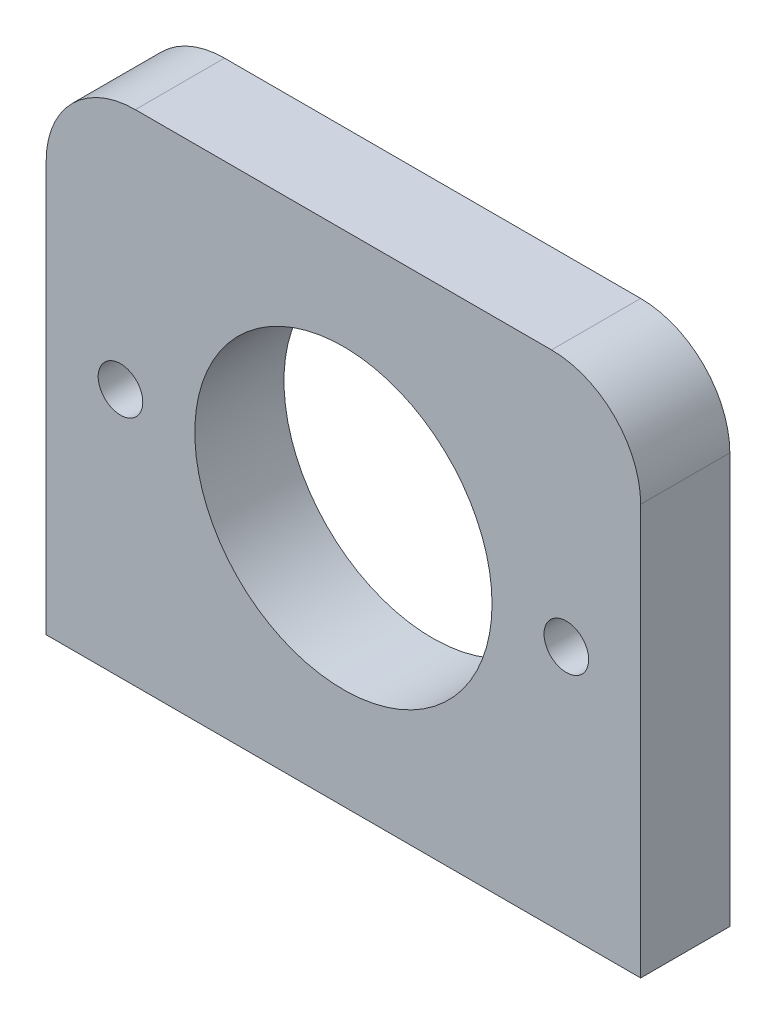
ISO-10303-21;
HEADER;
FILE_DESCRIPTION(('STEP AP214'),'2;1');
FILE_NAME('part.step','',(''),(''),'','','');
FILE_SCHEMA(('AUTOMOTIVE_DESIGN { 1 0 10303 214 1 1 1 1 }'));
ENDSEC;
DATA;
#1=APPLICATION_CONTEXT('core data for automotive mechanical design processes');
#2=APPLICATION_PROTOCOL_DEFINITION('international standard','automotive_design',2000,#1);
#3=PRODUCT_CONTEXT('',#1,'mechanical');
#4=PRODUCT('Part','Part','',(#3));
#5=PRODUCT_RELATED_PRODUCT_CATEGORY('part','',(#4));
#6=PRODUCT_DEFINITION_FORMATION('','',#4);
#7=PRODUCT_DEFINITION_CONTEXT('part definition',#1,'design');
#8=PRODUCT_DEFINITION('design','',#6,#7);
#9=PRODUCT_DEFINITION_SHAPE('','',#8);
#10=(LENGTH_UNIT() NAMED_UNIT(*) SI_UNIT(.MILLI.,.METRE.));
#11=(NAMED_UNIT(*) PLANE_ANGLE_UNIT() SI_UNIT($,.RADIAN.));
#12=(NAMED_UNIT(*) SI_UNIT($,.STERADIAN.) SOLID_ANGLE_UNIT());
#13=UNCERTAINTY_MEASURE_WITH_UNIT(LENGTH_MEASURE(1.E-05),#10,'distance_accuracy_value','');
#14=(GEOMETRIC_REPRESENTATION_CONTEXT(3) GLOBAL_UNCERTAINTY_ASSIGNED_CONTEXT((#13)) GLOBAL_UNIT_ASSIGNED_CONTEXT((#10,
#11,#12)) REPRESENTATION_CONTEXT('',''));
#15=CARTESIAN_POINT('',(0.,0.,0.));
#16=DIRECTION('',(0.,0.,1.));
#17=DIRECTION('',(1.,0.,0.));
#18=AXIS2_PLACEMENT_3D('',#15,#16,#17);
#19=CARTESIAN_POINT('',(-35.,27.,15.));
#20=DIRECTION('',(0.,0.,-1.));
#21=DIRECTION('',(-1.,0.,0.));
#22=AXIS2_PLACEMENT_3D('',#19,#20,#21);
#23=PLANE('',#22);
#24=DIRECTION('',(0.,-1.,0.));
#25=VECTOR('',#24,1.);
#26=CARTESIAN_POINT('',(-50.,-42.,15.));
#27=LINE('',#26,#25);
#28=CARTESIAN_POINT('',(-50.,27.,15.));
#29=VERTEX_POINT('',#28);
#30=CARTESIAN_POINT('',(-50.,-42.,15.));
#31=VERTEX_POINT('',#30);
#32=EDGE_CURVE('E144',#29,#31,#27,.T.);
#33=ORIENTED_EDGE('',*,*,#32,.T.);
#34=DIRECTION('',(1.,0.,0.));
#35=VECTOR('',#34,1.);
#36=CARTESIAN_POINT('',(-50.,-42.,15.));
#37=LINE('',#36,#35);
#38=CARTESIAN_POINT('',(50.,-42.,15.));
#39=VERTEX_POINT('',#38);
#40=EDGE_CURVE('E92',#31,#39,#37,.T.);
#41=ORIENTED_EDGE('',*,*,#40,.T.);
#42=DIRECTION('',(0.,1.,0.));
#43=VECTOR('',#42,1.);
#44=CARTESIAN_POINT('',(50.,-42.,15.));
#45=LINE('',#44,#43);
#46=CARTESIAN_POINT('',(50.,27.,15.));
#47=VERTEX_POINT('',#46);
#48=EDGE_CURVE('E105',#39,#47,#45,.T.);
#49=ORIENTED_EDGE('',*,*,#48,.T.);
#50=CARTESIAN_POINT('',(35.,27.,15.));
#51=DIRECTION('',(0.,0.,1.));
#52=DIRECTION('',(-1.,0.,0.));
#53=AXIS2_PLACEMENT_3D('',#50,#51,#52);
#54=CIRCLE('',#53,15.);
#55=CARTESIAN_POINT('',(35.,42.,15.));
#56=VERTEX_POINT('',#55);
#57=EDGE_CURVE('E99',#47,#56,#54,.T.);
#58=ORIENTED_EDGE('',*,*,#57,.T.);
#59=DIRECTION('',(-1.,0.,0.));
#60=VECTOR('',#59,1.);
#61=CARTESIAN_POINT('',(-35.,42.,15.));
#62=LINE('',#61,#60);
#63=CARTESIAN_POINT('',(-35.,42.,15.));
#64=VERTEX_POINT('',#63);
#65=EDGE_CURVE('E103',#56,#64,#62,.T.);
#66=ORIENTED_EDGE('',*,*,#65,.T.);
#67=CARTESIAN_POINT('',(-35.,27.,15.));
#68=DIRECTION('',(0.,0.,1.));
#69=DIRECTION('',(-1.,0.,0.));
#70=AXIS2_PLACEMENT_3D('',#67,#68,#69);
#71=CIRCLE('',#70,15.);
#72=EDGE_CURVE('E55',#64,#29,#71,.T.);
#73=ORIENTED_EDGE('',*,*,#72,.T.);
#74=EDGE_LOOP('',(#33,#41,#49,#58,#66,#73));
#75=FACE_BOUND('',#74,.T.);
#76=CARTESIAN_POINT('',(0.,0.,15.));
#77=DIRECTION('',(0.,0.,1.));
#78=DIRECTION('',(1.,0.,0.));
#79=AXIS2_PLACEMENT_3D('',#76,#77,#78);
#80=CIRCLE('',#79,25.);
#81=CARTESIAN_POINT('',(25.,0.,15.));
#82=VERTEX_POINT('',#81);
#83=EDGE_CURVE('E132',#82,#82,#80,.T.);
#84=ORIENTED_EDGE('',*,*,#83,.F.);
#85=EDGE_LOOP('',(#84));
#86=FACE_BOUND('',#85,.T.);
#87=CARTESIAN_POINT('',(-37.5,0.,15.));
#88=DIRECTION('',(0.,0.,1.));
#89=DIRECTION('',(1.,0.,0.));
#90=AXIS2_PLACEMENT_3D('',#87,#88,#89);
#91=CIRCLE('',#90,3.74999999999997);
#92=CARTESIAN_POINT('',(-33.75,0.,15.));
#93=VERTEX_POINT('',#92);
#94=EDGE_CURVE('E204',#93,#93,#91,.T.);
#95=ORIENTED_EDGE('',*,*,#94,.F.);
#96=EDGE_LOOP('',(#95));
#97=FACE_BOUND('',#96,.T.);
#98=CARTESIAN_POINT('',(37.5,0.,15.));
#99=DIRECTION('',(0.,0.,1.));
#100=DIRECTION('',(-1.,0.,0.));
#101=AXIS2_PLACEMENT_3D('',#98,#99,#100);
#102=CIRCLE('',#101,3.75);
#103=CARTESIAN_POINT('',(33.75,0.,15.));
#104=VERTEX_POINT('',#103);
#105=EDGE_CURVE('E193',#104,#104,#102,.T.);
#106=ORIENTED_EDGE('',*,*,#105,.F.);
#107=EDGE_LOOP('',(#106));
#108=FACE_BOUND('',#107,.T.);
#109=ADVANCED_FACE('F37',(#75,#86,#97,#108),#23,.F.);
#110=CARTESIAN_POINT('',(-35.,27.,0.));
#111=DIRECTION('',(0.,0.,-1.));
#112=DIRECTION('',(-1.,0.,0.));
#113=AXIS2_PLACEMENT_3D('',#110,#111,#112);
#114=PLANE('',#113);
#115=CARTESIAN_POINT('',(-37.5,0.,0.));
#116=DIRECTION('',(0.,0.,1.));
#117=DIRECTION('',(1.,0.,0.));
#118=AXIS2_PLACEMENT_3D('',#115,#116,#117);
#119=CIRCLE('',#118,3.74999999999997);
#120=CARTESIAN_POINT('',(-33.75,0.,0.));
#121=VERTEX_POINT('',#120);
#122=EDGE_CURVE('E201',#121,#121,#119,.T.);
#123=ORIENTED_EDGE('',*,*,#122,.T.);
#124=EDGE_LOOP('',(#123));
#125=FACE_BOUND('',#124,.T.);
#126=DIRECTION('',(0.,-1.,0.));
#127=VECTOR('',#126,1.);
#128=CARTESIAN_POINT('',(-50.,-42.,0.));
#129=LINE('',#128,#127);
#130=CARTESIAN_POINT('',(-50.,27.,0.));
#131=VERTEX_POINT('',#130);
#132=CARTESIAN_POINT('',(-50.,-42.,0.));
#133=VERTEX_POINT('',#132);
#134=EDGE_CURVE('E127',#131,#133,#129,.T.);
#135=ORIENTED_EDGE('',*,*,#134,.F.);
#136=CARTESIAN_POINT('',(-35.,27.,0.));
#137=DIRECTION('',(0.,0.,1.));
#138=DIRECTION('',(-1.,0.,0.));
#139=AXIS2_PLACEMENT_3D('',#136,#137,#138);
#140=CIRCLE('',#139,15.);
#141=CARTESIAN_POINT('',(-35.,42.,0.));
#142=VERTEX_POINT('',#141);
#143=EDGE_CURVE('E84',#142,#131,#140,.T.);
#144=ORIENTED_EDGE('',*,*,#143,.F.);
#145=DIRECTION('',(-1.,0.,0.));
#146=VECTOR('',#145,1.);
#147=CARTESIAN_POINT('',(-35.,42.,0.));
#148=LINE('',#147,#146);
#149=CARTESIAN_POINT('',(35.,42.,0.));
#150=VERTEX_POINT('',#149);
#151=EDGE_CURVE('E78',#150,#142,#148,.T.);
#152=ORIENTED_EDGE('',*,*,#151,.F.);
#153=CARTESIAN_POINT('',(35.,27.,0.));
#154=DIRECTION('',(0.,0.,1.));
#155=DIRECTION('',(-1.,0.,0.));
#156=AXIS2_PLACEMENT_3D('',#153,#154,#155);
#157=CIRCLE('',#156,15.);
#158=CARTESIAN_POINT('',(50.,27.,0.));
#159=VERTEX_POINT('',#158);
#160=EDGE_CURVE('E114',#159,#150,#157,.T.);
#161=ORIENTED_EDGE('',*,*,#160,.F.);
#162=DIRECTION('',(0.,1.,0.));
#163=VECTOR('',#162,1.);
#164=CARTESIAN_POINT('',(50.,-42.,0.));
#165=LINE('',#164,#163);
#166=CARTESIAN_POINT('',(50.,-42.,0.));
#167=VERTEX_POINT('',#166);
#168=EDGE_CURVE('E135',#167,#159,#165,.T.);
#169=ORIENTED_EDGE('',*,*,#168,.F.);
#170=DIRECTION('',(1.,0.,0.));
#171=VECTOR('',#170,1.);
#172=CARTESIAN_POINT('',(-50.,-42.,0.));
#173=LINE('',#172,#171);
#174=EDGE_CURVE('E131',#133,#167,#173,.T.);
#175=ORIENTED_EDGE('',*,*,#174,.F.);
#176=EDGE_LOOP('',(#135,#144,#152,#161,#169,#175));
#177=FACE_BOUND('',#176,.T.);
#178=CARTESIAN_POINT('',(0.,0.,0.));
#179=DIRECTION('',(0.,0.,1.));
#180=DIRECTION('',(1.,0.,0.));
#181=AXIS2_PLACEMENT_3D('',#178,#179,#180);
#182=CIRCLE('',#181,25.);
#183=CARTESIAN_POINT('',(25.,0.,0.));
#184=VERTEX_POINT('',#183);
#185=EDGE_CURVE('E208',#184,#184,#182,.T.);
#186=ORIENTED_EDGE('',*,*,#185,.T.);
#187=EDGE_LOOP('',(#186));
#188=FACE_BOUND('',#187,.T.);
#189=CARTESIAN_POINT('',(37.5,0.,0.));
#190=DIRECTION('',(0.,0.,1.));
#191=DIRECTION('',(-1.,0.,0.));
#192=AXIS2_PLACEMENT_3D('',#189,#190,#191);
#193=CIRCLE('',#192,3.75);
#194=CARTESIAN_POINT('',(33.75,0.,0.));
#195=VERTEX_POINT('',#194);
#196=EDGE_CURVE('E196',#195,#195,#193,.T.);
#197=ORIENTED_EDGE('',*,*,#196,.T.);
#198=EDGE_LOOP('',(#197));
#199=FACE_BOUND('',#198,.T.);
#200=ADVANCED_FACE('F157',(#125,#177,#188,#199),#114,.T.);
#201=CARTESIAN_POINT('',(-50.,-42.,15.));
#202=DIRECTION('',(1.,0.,0.));
#203=DIRECTION('',(0.,0.,-1.));
#204=AXIS2_PLACEMENT_3D('',#201,#202,#203);
#205=PLANE('',#204);
#206=ORIENTED_EDGE('',*,*,#134,.T.);
#207=DIRECTION('',(0.,0.,-1.));
#208=VECTOR('',#207,1.);
#209=CARTESIAN_POINT('',(-50.,-42.,15.));
#210=LINE('',#209,#208);
#211=EDGE_CURVE('E11',#31,#133,#210,.T.);
#212=ORIENTED_EDGE('',*,*,#211,.F.);
#213=ORIENTED_EDGE('',*,*,#32,.F.);
#214=DIRECTION('',(0.,0.,-1.));
#215=VECTOR('',#214,1.);
#216=CARTESIAN_POINT('',(-50.,27.,15.));
#217=LINE('',#216,#215);
#218=EDGE_CURVE('E123',#29,#131,#217,.T.);
#219=ORIENTED_EDGE('',*,*,#218,.T.);
#220=EDGE_LOOP('',(#206,#212,#213,#219));
#221=FACE_BOUND('',#220,.T.);
#222=ADVANCED_FACE('F39',(#221),#205,.F.);
#223=CARTESIAN_POINT('',(-50.,-42.,15.));
#224=DIRECTION('',(0.,1.,0.));
#225=DIRECTION('',(0.,0.,1.));
#226=AXIS2_PLACEMENT_3D('',#223,#224,#225);
#227=PLANE('',#226);
#228=ORIENTED_EDGE('',*,*,#174,.T.);
#229=DIRECTION('',(0.,0.,-1.));
#230=VECTOR('',#229,1.);
#231=CARTESIAN_POINT('',(50.,-42.,15.));
#232=LINE('',#231,#230);
#233=EDGE_CURVE('E47',#39,#167,#232,.T.);
#234=ORIENTED_EDGE('',*,*,#233,.F.);
#235=ORIENTED_EDGE('',*,*,#40,.F.);
#236=ORIENTED_EDGE('',*,*,#211,.T.);
#237=EDGE_LOOP('',(#228,#234,#235,#236));
#238=FACE_BOUND('',#237,.T.);
#239=ADVANCED_FACE('F265',(#238),#227,.F.);
#240=CARTESIAN_POINT('',(50.,-42.,15.));
#241=DIRECTION('',(-1.,0.,0.));
#242=DIRECTION('',(0.,0.,1.));
#243=AXIS2_PLACEMENT_3D('',#240,#241,#242);
#244=PLANE('',#243);
#245=ORIENTED_EDGE('',*,*,#168,.T.);
#246=DIRECTION('',(0.,0.,-1.));
#247=VECTOR('',#246,1.);
#248=CARTESIAN_POINT('',(50.,27.,15.));
#249=LINE('',#248,#247);
#250=EDGE_CURVE('E116',#47,#159,#249,.T.);
#251=ORIENTED_EDGE('',*,*,#250,.F.);
#252=ORIENTED_EDGE('',*,*,#48,.F.);
#253=ORIENTED_EDGE('',*,*,#233,.T.);
#254=EDGE_LOOP('',(#245,#251,#252,#253));
#255=FACE_BOUND('',#254,.T.);
#256=ADVANCED_FACE('F154',(#255),#244,.F.);
#257=CARTESIAN_POINT('',(35.,27.,15.));
#258=DIRECTION('',(0.,0.,-1.));
#259=DIRECTION('',(-1.,0.,0.));
#260=AXIS2_PLACEMENT_3D('',#257,#258,#259);
#261=CYLINDRICAL_SURFACE('',#260,15.);
#262=ORIENTED_EDGE('',*,*,#160,.T.);
#263=DIRECTION('',(0.,0.,-1.));
#264=VECTOR('',#263,1.);
#265=CARTESIAN_POINT('',(35.,42.,15.));
#266=LINE('',#265,#264);
#267=EDGE_CURVE('E111',#56,#150,#266,.T.);
#268=ORIENTED_EDGE('',*,*,#267,.F.);
#269=ORIENTED_EDGE('',*,*,#57,.F.);
#270=ORIENTED_EDGE('',*,*,#250,.T.);
#271=EDGE_LOOP('',(#262,#268,#269,#270));
#272=FACE_BOUND('',#271,.T.);
#273=ADVANCED_FACE('F112',(#272),#261,.T.);
#274=CARTESIAN_POINT('',(-35.,42.,15.));
#275=DIRECTION('',(0.,-1.,0.));
#276=DIRECTION('',(1.,0.,0.));
#277=AXIS2_PLACEMENT_3D('',#274,#275,#276);
#278=PLANE('',#277);
#279=ORIENTED_EDGE('',*,*,#151,.T.);
#280=DIRECTION('',(0.,0.,-1.));
#281=VECTOR('',#280,1.);
#282=CARTESIAN_POINT('',(-35.,42.,15.));
#283=LINE('',#282,#281);
#284=EDGE_CURVE('E117',#64,#142,#283,.T.);
#285=ORIENTED_EDGE('',*,*,#284,.F.);
#286=ORIENTED_EDGE('',*,*,#65,.F.);
#287=ORIENTED_EDGE('',*,*,#267,.T.);
#288=EDGE_LOOP('',(#279,#285,#286,#287));
#289=FACE_BOUND('',#288,.T.);
#290=ADVANCED_FACE('F119',(#289),#278,.F.);
#291=CARTESIAN_POINT('',(-35.,27.,15.));
#292=DIRECTION('',(0.,0.,-1.));
#293=DIRECTION('',(-1.,0.,0.));
#294=AXIS2_PLACEMENT_3D('',#291,#292,#293);
#295=CYLINDRICAL_SURFACE('',#294,15.);
#296=ORIENTED_EDGE('',*,*,#143,.T.);
#297=ORIENTED_EDGE('',*,*,#218,.F.);
#298=ORIENTED_EDGE('',*,*,#72,.F.);
#299=ORIENTED_EDGE('',*,*,#284,.T.);
#300=EDGE_LOOP('',(#296,#297,#298,#299));
#301=FACE_BOUND('',#300,.T.);
#302=ADVANCED_FACE('F162',(#301),#295,.T.);
#303=CARTESIAN_POINT('',(0.,0.,15.));
#304=DIRECTION('',(0.,0.,-1.));
#305=DIRECTION('',(-1.,0.,0.));
#306=AXIS2_PLACEMENT_3D('',#303,#304,#305);
#307=CYLINDRICAL_SURFACE('',#306,25.);
#308=ORIENTED_EDGE('',*,*,#83,.T.);
#309=EDGE_LOOP('',(#308));
#310=FACE_BOUND('',#309,.T.);
#311=ORIENTED_EDGE('',*,*,#185,.F.);
#312=EDGE_LOOP('',(#311));
#313=FACE_BOUND('',#312,.T.);
#314=ADVANCED_FACE('F164',(#310,#313),#307,.F.);
#315=CARTESIAN_POINT('',(-37.5,0.,15.));
#316=DIRECTION('',(0.,0.,-1.));
#317=DIRECTION('',(-1.,0.,0.));
#318=AXIS2_PLACEMENT_3D('',#315,#316,#317);
#319=CYLINDRICAL_SURFACE('',#318,3.74999999999997);
#320=ORIENTED_EDGE('',*,*,#94,.T.);
#321=EDGE_LOOP('',(#320));
#322=FACE_BOUND('',#321,.T.);
#323=ORIENTED_EDGE('',*,*,#122,.F.);
#324=EDGE_LOOP('',(#323));
#325=FACE_BOUND('',#324,.T.);
#326=ADVANCED_FACE('F170',(#322,#325),#319,.F.);
#327=CARTESIAN_POINT('',(37.5,0.,15.));
#328=DIRECTION('',(0.,0.,-1.));
#329=DIRECTION('',(-1.,0.,0.));
#330=AXIS2_PLACEMENT_3D('',#327,#328,#329);
#331=CYLINDRICAL_SURFACE('',#330,3.75);
#332=ORIENTED_EDGE('',*,*,#105,.T.);
#333=EDGE_LOOP('',(#332));
#334=FACE_BOUND('',#333,.T.);
#335=ORIENTED_EDGE('',*,*,#196,.F.);
#336=EDGE_LOOP('',(#335));
#337=FACE_BOUND('',#336,.T.);
#338=ADVANCED_FACE('F184',(#334,#337),#331,.F.);
#339=CLOSED_SHELL('',(#109,#200,#222,#239,#256,#273,#290,#302,#314,#326,#338));
#340=MANIFOLD_SOLID_BREP('B2',#339);
#341=ADVANCED_BREP_SHAPE_REPRESENTATION('',(#18,#340),#14);
#342=SHAPE_DEFINITION_REPRESENTATION(#9,#341);
ENDSEC;
END-ISO-10303-21;
